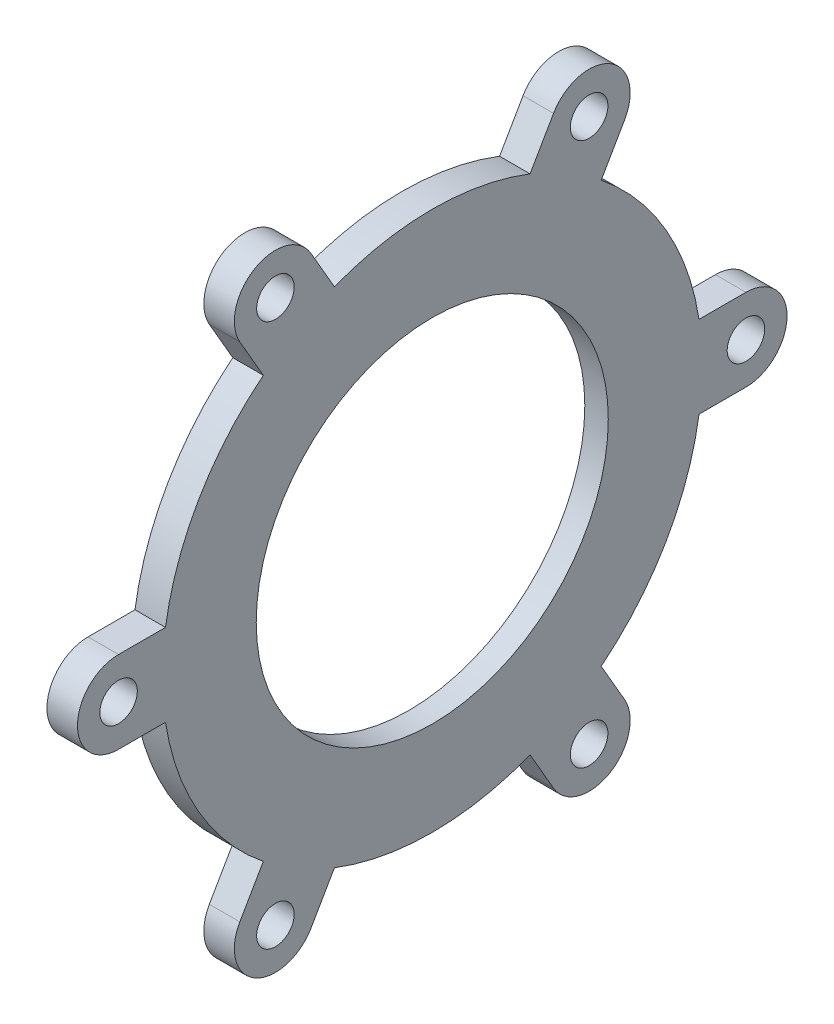
ISO-10303-21;
HEADER;
FILE_DESCRIPTION(('STEP AP214'),'2;1');
FILE_NAME('part.step','',(''),(''),'','','');
FILE_SCHEMA(('AUTOMOTIVE_DESIGN { 1 0 10303 214 1 1 1 1 }'));
ENDSEC;
DATA;
#1=APPLICATION_CONTEXT('core data for automotive mechanical design processes');
#2=APPLICATION_PROTOCOL_DEFINITION('international standard','automotive_design',2000,#1);
#3=PRODUCT_CONTEXT('',#1,'mechanical');
#4=PRODUCT('Part','Part','',(#3));
#5=PRODUCT_RELATED_PRODUCT_CATEGORY('part','',(#4));
#6=PRODUCT_DEFINITION_FORMATION('','',#4);
#7=PRODUCT_DEFINITION_CONTEXT('part definition',#1,'design');
#8=PRODUCT_DEFINITION('design','',#6,#7);
#9=PRODUCT_DEFINITION_SHAPE('','',#8);
#10=(LENGTH_UNIT() NAMED_UNIT(*) SI_UNIT(.MILLI.,.METRE.));
#11=(NAMED_UNIT(*) PLANE_ANGLE_UNIT() SI_UNIT($,.RADIAN.));
#12=(NAMED_UNIT(*) SI_UNIT($,.STERADIAN.) SOLID_ANGLE_UNIT());
#13=UNCERTAINTY_MEASURE_WITH_UNIT(LENGTH_MEASURE(1.E-05),#10,'distance_accuracy_value','');
#14=(GEOMETRIC_REPRESENTATION_CONTEXT(3) GLOBAL_UNCERTAINTY_ASSIGNED_CONTEXT((#13)) GLOBAL_UNIT_ASSIGNED_CONTEXT((#10,
#11,#12)) REPRESENTATION_CONTEXT('',''));
#15=CARTESIAN_POINT('',(0.,0.,0.));
#16=DIRECTION('',(0.,0.,1.));
#17=DIRECTION('',(1.,0.,0.));
#18=AXIS2_PLACEMENT_3D('',#15,#16,#17);
#19=CARTESIAN_POINT('',(0.,0.,0.));
#20=DIRECTION('',(1.,0.,0.));
#21=DIRECTION('',(0.,0.,-1.));
#22=AXIS2_PLACEMENT_3D('',#19,#20,#21);
#23=PLANE('',#22);
#24=CARTESIAN_POINT('',(0.,0.,0.));
#25=DIRECTION('',(1.,0.,0.));
#26=DIRECTION('',(0.,0.,-1.));
#27=AXIS2_PLACEMENT_3D('',#24,#25,#26);
#28=CIRCLE('',#27,92.5);
#29=CARTESIAN_POINT('',(0.,0.,-92.5));
#30=VERTEX_POINT('',#29);
#31=EDGE_CURVE('E11',#30,#30,#28,.F.);
#32=ORIENTED_EDGE('',*,*,#31,.T.);
#33=EDGE_LOOP('',(#32));
#34=FACE_BOUND('',#33,.T.);
#35=CARTESIAN_POINT('',(0.,0.,0.));
#36=DIRECTION('',(1.,0.,0.));
#37=DIRECTION('',(0.,0.,-1.));
#38=AXIS2_PLACEMENT_3D('',#35,#36,#37);
#39=CIRCLE('',#38,75.);
#40=CARTESIAN_POINT('',(0.,0.,-75.));
#41=VERTEX_POINT('',#40);
#42=EDGE_CURVE('E309',#41,#41,#39,.T.);
#43=ORIENTED_EDGE('',*,*,#42,.T.);
#44=EDGE_LOOP('',(#43));
#45=FACE_BOUND('',#44,.T.);
#46=ADVANCED_FACE('F35',(#34,#45),#23,.F.);
#47=CARTESIAN_POINT('',(10.,0.,0.));
#48=DIRECTION('',(-1.,0.,0.));
#49=DIRECTION('',(0.,0.,1.));
#50=AXIS2_PLACEMENT_3D('',#47,#48,#49);
#51=CYLINDRICAL_SURFACE('',#50,115.);
#52=DIRECTION('',(-1.,0.,0.));
#53=VECTOR('',#52,1.);
#54=CARTESIAN_POINT('',(10.,17.5,-113.660679216693));
#55=LINE('',#54,#53);
#56=CARTESIAN_POINT('',(10.,17.5,-113.660679216693));
#57=VERTEX_POINT('',#56);
#58=CARTESIAN_POINT('',(-3.,17.5,-113.660679216693));
#59=VERTEX_POINT('',#58);
#60=EDGE_CURVE('E50',#57,#59,#55,.T.);
#61=ORIENTED_EDGE('',*,*,#60,.T.);
#62=CARTESIAN_POINT('',(-3.,0.,0.));
#63=DIRECTION('',(1.,0.,0.));
#64=DIRECTION('',(0.,0.,-1.));
#65=AXIS2_PLACEMENT_3D('',#62,#63,#64);
#66=CIRCLE('',#65,115.);
#67=CARTESIAN_POINT('',(-3.,89.6830356130487,-71.985784174571));
#68=VERTEX_POINT('',#67);
#69=EDGE_CURVE('E215',#59,#68,#66,.T.);
#70=ORIENTED_EDGE('',*,*,#69,.T.);
#71=DIRECTION('',(-1.,0.,0.));
#72=VECTOR('',#71,1.);
#73=CARTESIAN_POINT('',(10.,89.6830356130487,-71.985784174571));
#74=LINE('',#73,#72);
#75=CARTESIAN_POINT('',(10.,89.6830356130487,-71.985784174571));
#76=VERTEX_POINT('',#75);
#77=EDGE_CURVE('E198',#76,#68,#74,.T.);
#78=ORIENTED_EDGE('',*,*,#77,.F.);
#79=CARTESIAN_POINT('',(10.,0.,0.));
#80=DIRECTION('',(1.,0.,0.));
#81=DIRECTION('',(0.,0.,-1.));
#82=AXIS2_PLACEMENT_3D('',#79,#80,#81);
#83=CIRCLE('',#82,115.);
#84=EDGE_CURVE('E313',#57,#76,#83,.T.);
#85=ORIENTED_EDGE('',*,*,#84,.F.);
#86=EDGE_LOOP('',(#61,#70,#78,#85));
#87=FACE_BOUND('',#86,.T.);
#88=ADVANCED_FACE('F220',(#87),#51,.T.);
#89=CARTESIAN_POINT('',(10.,-8.74999999999879,-15.1554445662256));
#90=DIRECTION('',(0.,0.499999999999999,0.866025403784439));
#91=DIRECTION('',(0.,-0.866025403784439,0.499999999999999));
#92=AXIS2_PLACEMENT_3D('',#89,#90,#91);
#93=PLANE('',#92);
#94=ORIENTED_EDGE('',*,*,#77,.T.);
#95=DIRECTION('',(0.,0.866025403784439,-0.499999999999999));
#96=VECTOR('',#95,1.);
#97=CARTESIAN_POINT('',(-3.,-8.74999999999879,-15.1554445662256));
#98=LINE('',#97,#96);
#99=CARTESIAN_POINT('',(-3.,107.003543688735,-81.985784174569));
#100=VERTEX_POINT('',#99);
#101=EDGE_CURVE('E202',#68,#100,#98,.T.);
#102=ORIENTED_EDGE('',*,*,#101,.T.);
#103=DIRECTION('',(-1.,0.,0.));
#104=VECTOR('',#103,1.);
#105=CARTESIAN_POINT('',(10.,107.003543688735,-81.985784174569));
#106=LINE('',#105,#104);
#107=CARTESIAN_POINT('',(10.,107.003543688735,-81.985784174569));
#108=VERTEX_POINT('',#107);
#109=EDGE_CURVE('E207',#108,#100,#106,.T.);
#110=ORIENTED_EDGE('',*,*,#109,.F.);
#111=DIRECTION('',(0.,0.866025403784439,-0.499999999999999));
#112=VECTOR('',#111,1.);
#113=CARTESIAN_POINT('',(10.,-8.74999999999879,-15.1554445662256));
#114=LINE('',#113,#112);
#115=EDGE_CURVE('E203',#76,#108,#114,.T.);
#116=ORIENTED_EDGE('',*,*,#115,.F.);
#117=EDGE_LOOP('',(#94,#102,#110,#116));
#118=FACE_BOUND('',#117,.T.);
#119=ADVANCED_FACE('F200',(#118),#93,.F.);
#120=CARTESIAN_POINT('',(10.,115.753543688735,-66.8303396083414));
#121=DIRECTION('',(-1.,0.,0.));
#122=DIRECTION('',(0.,0.,1.));
#123=AXIS2_PLACEMENT_3D('',#120,#121,#122);
#124=CYLINDRICAL_SURFACE('',#123,17.5);
#125=ORIENTED_EDGE('',*,*,#109,.T.);
#126=CARTESIAN_POINT('',(-3.,115.753543688735,-66.8303396083414));
#127=DIRECTION('',(1.,0.,0.));
#128=DIRECTION('',(0.,0.,-1.));
#129=AXIS2_PLACEMENT_3D('',#126,#127,#128);
#130=CIRCLE('',#129,17.5);
#131=CARTESIAN_POINT('',(-3.,124.503543688735,-51.6748950421137));
#132=VERTEX_POINT('',#131);
#133=EDGE_CURVE('E218',#132,#100,#130,.F.);
#134=ORIENTED_EDGE('',*,*,#133,.F.);
#135=DIRECTION('',(-1.,0.,0.));
#136=VECTOR('',#135,1.);
#137=CARTESIAN_POINT('',(10.,124.503543688735,-51.6748950421137));
#138=LINE('',#137,#136);
#139=CARTESIAN_POINT('',(10.,124.503543688735,-51.6748950421137));
#140=VERTEX_POINT('',#139);
#141=EDGE_CURVE('E425',#140,#132,#138,.T.);
#142=ORIENTED_EDGE('',*,*,#141,.F.);
#143=CARTESIAN_POINT('',(10.,115.753543688735,-66.8303396083414));
#144=DIRECTION('',(1.,0.,0.));
#145=DIRECTION('',(0.,0.,-1.));
#146=AXIS2_PLACEMENT_3D('',#143,#144,#145);
#147=CIRCLE('',#146,17.5);
#148=EDGE_CURVE('E318',#140,#108,#147,.F.);
#149=ORIENTED_EDGE('',*,*,#148,.T.);
#150=EDGE_LOOP('',(#125,#134,#142,#149));
#151=FACE_BOUND('',#150,.T.);
#152=ADVANCED_FACE('F546',(#151),#124,.T.);
#153=CARTESIAN_POINT('',(10.,8.75000000000122,15.1554445662298));
#154=DIRECTION('',(0.,0.5,0.866025403784439));
#155=DIRECTION('',(0.,-0.866025403784439,0.5));
#156=AXIS2_PLACEMENT_3D('',#153,#154,#155);
#157=PLANE('',#156);
#158=ORIENTED_EDGE('',*,*,#141,.T.);
#159=DIRECTION('',(0.,0.866025403784439,-0.5));
#160=VECTOR('',#159,1.);
#161=CARTESIAN_POINT('',(-3.,8.75000000000122,15.1554445662298));
#162=LINE('',#161,#160);
#163=CARTESIAN_POINT('',(-3.,107.183035613049,-41.6748950421147));
#164=VERTEX_POINT('',#163);
#165=EDGE_CURVE('E233',#164,#132,#162,.T.);
#166=ORIENTED_EDGE('',*,*,#165,.F.);
#167=DIRECTION('',(-1.,0.,0.));
#168=VECTOR('',#167,1.);
#169=CARTESIAN_POINT('',(10.,107.183035613049,-41.6748950421147));
#170=LINE('',#169,#168);
#171=CARTESIAN_POINT('',(10.,107.183035613049,-41.6748950421147));
#172=VERTEX_POINT('',#171);
#173=EDGE_CURVE('E423',#172,#164,#170,.T.);
#174=ORIENTED_EDGE('',*,*,#173,.F.);
#175=DIRECTION('',(0.,0.866025403784439,-0.5));
#176=VECTOR('',#175,1.);
#177=CARTESIAN_POINT('',(10.,8.75000000000122,15.1554445662298));
#178=LINE('',#177,#176);
#179=EDGE_CURVE('E321',#172,#140,#178,.T.);
#180=ORIENTED_EDGE('',*,*,#179,.T.);
#181=EDGE_LOOP('',(#158,#166,#174,#180));
#182=FACE_BOUND('',#181,.T.);
#183=ADVANCED_FACE('F543',(#182),#157,.T.);
#184=ORIENTED_EDGE('',*,*,#173,.T.);
#185=CARTESIAN_POINT('',(-3.,107.183035613044,41.6748950421246));
#186=VERTEX_POINT('',#185);
#187=EDGE_CURVE('E224',#164,#186,#66,.T.);
#188=ORIENTED_EDGE('',*,*,#187,.T.);
#189=DIRECTION('',(-1.,0.,0.));
#190=VECTOR('',#189,1.);
#191=CARTESIAN_POINT('',(10.,107.183035613044,41.6748950421246));
#192=LINE('',#191,#190);
#193=CARTESIAN_POINT('',(10.,107.183035613044,41.6748950421246));
#194=VERTEX_POINT('',#193);
#195=EDGE_CURVE('E421',#194,#186,#192,.T.);
#196=ORIENTED_EDGE('',*,*,#195,.F.);
#197=EDGE_CURVE('E316',#172,#194,#83,.T.);
#198=ORIENTED_EDGE('',*,*,#197,.F.);
#199=EDGE_LOOP('',(#184,#188,#196,#198));
#200=FACE_BOUND('',#199,.T.);
#201=ADVANCED_FACE('F448',(#200),#51,.T.);
#202=CARTESIAN_POINT('',(10.,8.74999999999557,-15.15544456622));
#203=DIRECTION('',(0.,-0.5,0.866025403784438));
#204=DIRECTION('',(0.,-0.866025403784438,-0.5));
#205=AXIS2_PLACEMENT_3D('',#202,#203,#204);
#206=PLANE('',#205);
#207=ORIENTED_EDGE('',*,*,#195,.T.);
#208=DIRECTION('',(0.,0.866025403784438,0.5));
#209=VECTOR('',#208,1.);
#210=CARTESIAN_POINT('',(-3.,8.74999999999557,-15.15544456622));
#211=LINE('',#210,#209);
#212=CARTESIAN_POINT('',(-3.,124.503543688728,51.6748950421231));
#213=VERTEX_POINT('',#212);
#214=EDGE_CURVE('E232',#186,#213,#211,.T.);
#215=ORIENTED_EDGE('',*,*,#214,.T.);
#216=DIRECTION('',(-1.,0.,0.));
#217=VECTOR('',#216,1.);
#218=CARTESIAN_POINT('',(10.,124.503543688728,51.6748950421231));
#219=LINE('',#218,#217);
#220=CARTESIAN_POINT('',(10.,124.503543688728,51.6748950421231));
#221=VERTEX_POINT('',#220);
#222=EDGE_CURVE('E419',#221,#213,#219,.T.);
#223=ORIENTED_EDGE('',*,*,#222,.F.);
#224=DIRECTION('',(0.,0.866025403784438,0.5));
#225=VECTOR('',#224,1.);
#226=CARTESIAN_POINT('',(10.,8.74999999999557,-15.15544456622));
#227=LINE('',#226,#225);
#228=EDGE_CURVE('E324',#194,#221,#227,.T.);
#229=ORIENTED_EDGE('',*,*,#228,.F.);
#230=EDGE_LOOP('',(#207,#215,#223,#229));
#231=FACE_BOUND('',#230,.T.);
#232=ADVANCED_FACE('F538',(#231),#206,.F.);
#233=CARTESIAN_POINT('',(10.,115.753543688728,66.8303396083507));
#234=DIRECTION('',(-1.,0.,0.));
#235=DIRECTION('',(0.,0.,1.));
#236=AXIS2_PLACEMENT_3D('',#233,#234,#235);
#237=CYLINDRICAL_SURFACE('',#236,17.5);
#238=ORIENTED_EDGE('',*,*,#222,.T.);
#239=CARTESIAN_POINT('',(-3.,115.753543688728,66.8303396083507));
#240=DIRECTION('',(1.,0.,0.));
#241=DIRECTION('',(0.,0.,-1.));
#242=AXIS2_PLACEMENT_3D('',#239,#240,#241);
#243=CIRCLE('',#242,17.5);
#244=CARTESIAN_POINT('',(-3.,107.003543688728,81.9857841745784));
#245=VERTEX_POINT('',#244);
#246=EDGE_CURVE('E239',#245,#213,#243,.F.);
#247=ORIENTED_EDGE('',*,*,#246,.F.);
#248=DIRECTION('',(-1.,0.,0.));
#249=VECTOR('',#248,1.);
#250=CARTESIAN_POINT('',(10.,107.003543688728,81.9857841745784));
#251=LINE('',#250,#249);
#252=CARTESIAN_POINT('',(10.,107.003543688728,81.9857841745784));
#253=VERTEX_POINT('',#252);
#254=EDGE_CURVE('E417',#253,#245,#251,.T.);
#255=ORIENTED_EDGE('',*,*,#254,.F.);
#256=CARTESIAN_POINT('',(10.,115.753543688728,66.8303396083507));
#257=DIRECTION('',(1.,0.,0.));
#258=DIRECTION('',(0.,0.,-1.));
#259=AXIS2_PLACEMENT_3D('',#256,#257,#258);
#260=CIRCLE('',#259,17.5);
#261=EDGE_CURVE('E326',#253,#221,#260,.F.);
#262=ORIENTED_EDGE('',*,*,#261,.T.);
#263=EDGE_LOOP('',(#238,#247,#255,#262));
#264=FACE_BOUND('',#263,.T.);
#265=ADVANCED_FACE('F534',(#264),#237,.T.);
#266=CARTESIAN_POINT('',(10.,-8.75000000000442,15.1554445662353));
#267=DIRECTION('',(0.,-0.500000000000001,0.866025403784438));
#268=DIRECTION('',(0.,-0.866025403784438,-0.500000000000001));
#269=AXIS2_PLACEMENT_3D('',#266,#267,#268);
#270=PLANE('',#269);
#271=ORIENTED_EDGE('',*,*,#254,.T.);
#272=DIRECTION('',(0.,0.866025403784438,0.500000000000001));
#273=VECTOR('',#272,1.);
#274=CARTESIAN_POINT('',(-3.,-8.75000000000442,15.1554445662353));
#275=LINE('',#274,#273);
#276=CARTESIAN_POINT('',(-3.,89.6830356130418,71.9857841745801));
#277=VERTEX_POINT('',#276);
#278=EDGE_CURVE('E244',#277,#245,#275,.T.);
#279=ORIENTED_EDGE('',*,*,#278,.F.);
#280=DIRECTION('',(-1.,0.,0.));
#281=VECTOR('',#280,1.);
#282=CARTESIAN_POINT('',(10.,89.6830356130418,71.9857841745801));
#283=LINE('',#282,#281);
#284=CARTESIAN_POINT('',(10.,89.6830356130418,71.9857841745801));
#285=VERTEX_POINT('',#284);
#286=EDGE_CURVE('E415',#285,#277,#283,.T.);
#287=ORIENTED_EDGE('',*,*,#286,.F.);
#288=DIRECTION('',(0.,0.866025403784438,0.500000000000001));
#289=VECTOR('',#288,1.);
#290=CARTESIAN_POINT('',(10.,-8.75000000000442,15.1554445662353));
#291=LINE('',#290,#289);
#292=EDGE_CURVE('E329',#285,#253,#291,.T.);
#293=ORIENTED_EDGE('',*,*,#292,.T.);
#294=EDGE_LOOP('',(#271,#279,#287,#293));
#295=FACE_BOUND('',#294,.T.);
#296=ADVANCED_FACE('F531',(#295),#270,.T.);
#297=ORIENTED_EDGE('',*,*,#286,.T.);
#298=CARTESIAN_POINT('',(-3.,17.4999999999874,113.660679216693));
#299=VERTEX_POINT('',#298);
#300=EDGE_CURVE('E234',#277,#299,#66,.T.);
#301=ORIENTED_EDGE('',*,*,#300,.T.);
#302=DIRECTION('',(-1.,0.,0.));
#303=VECTOR('',#302,1.);
#304=CARTESIAN_POINT('',(10.,17.4999999999874,113.660679216693));
#305=LINE('',#304,#303);
#306=CARTESIAN_POINT('',(10.,17.4999999999874,113.660679216693));
#307=VERTEX_POINT('',#306);
#308=EDGE_CURVE('E413',#307,#299,#305,.T.);
#309=ORIENTED_EDGE('',*,*,#308,.F.);
#310=EDGE_CURVE('E332',#285,#307,#83,.T.);
#311=ORIENTED_EDGE('',*,*,#310,.F.);
#312=EDGE_LOOP('',(#297,#301,#309,#311));
#313=FACE_BOUND('',#312,.T.);
#314=ADVANCED_FACE('F529',(#313),#51,.T.);
#315=CARTESIAN_POINT('',(10.,17.4999999999871,0.));
#316=DIRECTION('',(0.,-1.,0.));
#317=DIRECTION('',(0.,0.,-1.));
#318=AXIS2_PLACEMENT_3D('',#315,#316,#317);
#319=PLANE('',#318);
#320=ORIENTED_EDGE('',*,*,#308,.T.);
#321=DIRECTION('',(0.,0.,1.));
#322=VECTOR('',#321,1.);
#323=CARTESIAN_POINT('',(-3.,17.4999999999871,0.));
#324=LINE('',#323,#322);
#325=CARTESIAN_POINT('',(-3.,17.4999999999871,133.660679216691));
#326=VERTEX_POINT('',#325);
#327=EDGE_CURVE('E243',#299,#326,#324,.T.);
#328=ORIENTED_EDGE('',*,*,#327,.T.);
#329=DIRECTION('',(-1.,0.,0.));
#330=VECTOR('',#329,1.);
#331=CARTESIAN_POINT('',(10.,17.4999999999871,133.660679216691));
#332=LINE('',#331,#330);
#333=CARTESIAN_POINT('',(10.,17.4999999999871,133.660679216691));
#334=VERTEX_POINT('',#333);
#335=EDGE_CURVE('E411',#334,#326,#332,.T.);
#336=ORIENTED_EDGE('',*,*,#335,.F.);
#337=DIRECTION('',(0.,0.,1.));
#338=VECTOR('',#337,1.);
#339=CARTESIAN_POINT('',(10.,17.4999999999871,0.));
#340=LINE('',#339,#338);
#341=EDGE_CURVE('E333',#307,#334,#340,.T.);
#342=ORIENTED_EDGE('',*,*,#341,.F.);
#343=EDGE_LOOP('',(#320,#328,#336,#342));
#344=FACE_BOUND('',#343,.T.);
#345=ADVANCED_FACE('F525',(#344),#319,.F.);
#346=CARTESIAN_POINT('',(10.,-1.29088335857571E-11,133.660679216691));
#347=DIRECTION('',(-1.,0.,0.));
#348=DIRECTION('',(0.,0.,1.));
#349=AXIS2_PLACEMENT_3D('',#346,#347,#348);
#350=CYLINDRICAL_SURFACE('',#349,17.5);
#351=ORIENTED_EDGE('',*,*,#335,.T.);
#352=CARTESIAN_POINT('',(-3.,-1.29088335857571E-11,133.660679216691));
#353=DIRECTION('',(1.,0.,0.));
#354=DIRECTION('',(0.,0.,-1.));
#355=AXIS2_PLACEMENT_3D('',#352,#353,#354);
#356=CIRCLE('',#355,17.5);
#357=CARTESIAN_POINT('',(-3.,-17.5000000000129,133.660679216691));
#358=VERTEX_POINT('',#357);
#359=EDGE_CURVE('E250',#358,#326,#356,.F.);
#360=ORIENTED_EDGE('',*,*,#359,.F.);
#361=DIRECTION('',(-1.,0.,0.));
#362=VECTOR('',#361,1.);
#363=CARTESIAN_POINT('',(10.,-17.5000000000129,133.660679216691));
#364=LINE('',#363,#362);
#365=CARTESIAN_POINT('',(10.,-17.5000000000129,133.660679216691));
#366=VERTEX_POINT('',#365);
#367=EDGE_CURVE('E409',#366,#358,#364,.T.);
#368=ORIENTED_EDGE('',*,*,#367,.F.);
#369=CARTESIAN_POINT('',(10.,-1.29088335857571E-11,133.660679216691));
#370=DIRECTION('',(1.,0.,0.));
#371=DIRECTION('',(0.,0.,-1.));
#372=AXIS2_PLACEMENT_3D('',#369,#370,#371);
#373=CIRCLE('',#372,17.5);
#374=EDGE_CURVE('E335',#366,#334,#373,.F.);
#375=ORIENTED_EDGE('',*,*,#374,.T.);
#376=EDGE_LOOP('',(#351,#360,#368,#375));
#377=FACE_BOUND('',#376,.T.);
#378=ADVANCED_FACE('F521',(#377),#350,.T.);
#379=CARTESIAN_POINT('',(10.,-17.5000000000129,0.));
#380=DIRECTION('',(0.,-1.,0.));
#381=DIRECTION('',(0.,0.,-1.));
#382=AXIS2_PLACEMENT_3D('',#379,#380,#381);
#383=PLANE('',#382);
#384=ORIENTED_EDGE('',*,*,#367,.T.);
#385=DIRECTION('',(0.,0.,1.));
#386=VECTOR('',#385,1.);
#387=CARTESIAN_POINT('',(-3.,-17.5000000000129,0.));
#388=LINE('',#387,#386);
#389=CARTESIAN_POINT('',(-3.,-17.5000000000129,113.660679216691));
#390=VERTEX_POINT('',#389);
#391=EDGE_CURVE('E256',#390,#358,#388,.T.);
#392=ORIENTED_EDGE('',*,*,#391,.F.);
#393=DIRECTION('',(-1.,0.,0.));
#394=VECTOR('',#393,1.);
#395=CARTESIAN_POINT('',(10.,-17.5000000000129,113.660679216691));
#396=LINE('',#395,#394);
#397=CARTESIAN_POINT('',(10.,-17.5000000000129,113.660679216691));
#398=VERTEX_POINT('',#397);
#399=EDGE_CURVE('E407',#398,#390,#396,.T.);
#400=ORIENTED_EDGE('',*,*,#399,.F.);
#401=DIRECTION('',(0.,0.,1.));
#402=VECTOR('',#401,1.);
#403=CARTESIAN_POINT('',(10.,-17.5000000000129,0.));
#404=LINE('',#403,#402);
#405=EDGE_CURVE('E338',#398,#366,#404,.T.);
#406=ORIENTED_EDGE('',*,*,#405,.T.);
#407=EDGE_LOOP('',(#384,#392,#400,#406));
#408=FACE_BOUND('',#407,.T.);
#409=ADVANCED_FACE('F518',(#408),#383,.T.);
#410=ORIENTED_EDGE('',*,*,#399,.T.);
#411=CARTESIAN_POINT('',(-3.,-89.683035613058,71.9857841745664));
#412=VERTEX_POINT('',#411);
#413=EDGE_CURVE('E245',#390,#412,#66,.T.);
#414=ORIENTED_EDGE('',*,*,#413,.T.);
#415=DIRECTION('',(-1.,0.,0.));
#416=VECTOR('',#415,1.);
#417=CARTESIAN_POINT('',(10.,-89.683035613058,71.9857841745664));
#418=LINE('',#417,#416);
#419=CARTESIAN_POINT('',(10.,-89.683035613058,71.9857841745664));
#420=VERTEX_POINT('',#419);
#421=EDGE_CURVE('E405',#420,#412,#418,.T.);
#422=ORIENTED_EDGE('',*,*,#421,.F.);
#423=EDGE_CURVE('E341',#398,#420,#83,.T.);
#424=ORIENTED_EDGE('',*,*,#423,.F.);
#425=EDGE_LOOP('',(#410,#414,#422,#424));
#426=FACE_BOUND('',#425,.T.);
#427=ADVANCED_FACE('F516',(#426),#51,.T.);
#428=CARTESIAN_POINT('',(10.,8.74999999999478,15.1554445662187));
#429=DIRECTION('',(0.,-0.499999999999999,-0.866025403784439));
#430=DIRECTION('',(0.,0.866025403784439,-0.499999999999999));
#431=AXIS2_PLACEMENT_3D('',#428,#429,#430);
#432=PLANE('',#431);
#433=ORIENTED_EDGE('',*,*,#421,.T.);
#434=DIRECTION('',(0.,-0.866025403784439,0.499999999999999));
#435=VECTOR('',#434,1.);
#436=CARTESIAN_POINT('',(-3.,8.74999999999478,15.1554445662187));
#437=LINE('',#436,#435);
#438=CARTESIAN_POINT('',(-3.,-107.003543688748,81.9857841745672));
#439=VERTEX_POINT('',#438);
#440=EDGE_CURVE('E255',#412,#439,#437,.T.);
#441=ORIENTED_EDGE('',*,*,#440,.T.);
#442=DIRECTION('',(-1.,0.,0.));
#443=VECTOR('',#442,1.);
#444=CARTESIAN_POINT('',(10.,-107.003543688748,81.9857841745672));
#445=LINE('',#444,#443);
#446=CARTESIAN_POINT('',(10.,-107.003543688748,81.9857841745672));
#447=VERTEX_POINT('',#446);
#448=EDGE_CURVE('E403',#447,#439,#445,.T.);
#449=ORIENTED_EDGE('',*,*,#448,.F.);
#450=DIRECTION('',(0.,-0.866025403784439,0.499999999999999));
#451=VECTOR('',#450,1.);
#452=CARTESIAN_POINT('',(10.,8.74999999999478,15.1554445662187));
#453=LINE('',#452,#451);
#454=EDGE_CURVE('E342',#420,#447,#453,.T.);
#455=ORIENTED_EDGE('',*,*,#454,.F.);
#456=EDGE_LOOP('',(#433,#441,#449,#455));
#457=FACE_BOUND('',#456,.T.);
#458=ADVANCED_FACE('F512',(#457),#432,.F.);
#459=CARTESIAN_POINT('',(10.,-115.753543688748,66.8303396083395));
#460=DIRECTION('',(-1.,0.,0.));
#461=DIRECTION('',(0.,0.,1.));
#462=AXIS2_PLACEMENT_3D('',#459,#460,#461);
#463=CYLINDRICAL_SURFACE('',#462,17.5);
#464=ORIENTED_EDGE('',*,*,#448,.T.);
#465=CARTESIAN_POINT('',(-3.,-115.753543688748,66.8303396083395));
#466=DIRECTION('',(1.,0.,0.));
#467=DIRECTION('',(0.,0.,-1.));
#468=AXIS2_PLACEMENT_3D('',#465,#466,#467);
#469=CIRCLE('',#468,17.5);
#470=CARTESIAN_POINT('',(-3.,-124.503543688748,51.6748950421118));
#471=VERTEX_POINT('',#470);
#472=EDGE_CURVE('E261',#471,#439,#469,.F.);
#473=ORIENTED_EDGE('',*,*,#472,.F.);
#474=DIRECTION('',(-1.,0.,0.));
#475=VECTOR('',#474,1.);
#476=CARTESIAN_POINT('',(10.,-124.503543688748,51.6748950421118));
#477=LINE('',#476,#475);
#478=CARTESIAN_POINT('',(10.,-124.503543688748,51.6748950421118));
#479=VERTEX_POINT('',#478);
#480=EDGE_CURVE('E401',#479,#471,#477,.T.);
#481=ORIENTED_EDGE('',*,*,#480,.F.);
#482=CARTESIAN_POINT('',(10.,-115.753543688748,66.8303396083395));
#483=DIRECTION('',(1.,0.,0.));
#484=DIRECTION('',(0.,0.,-1.));
#485=AXIS2_PLACEMENT_3D('',#482,#483,#484);
#486=CIRCLE('',#485,17.5);
#487=EDGE_CURVE('E344',#479,#447,#486,.F.);
#488=ORIENTED_EDGE('',*,*,#487,.T.);
#489=EDGE_LOOP('',(#464,#473,#481,#488));
#490=FACE_BOUND('',#489,.T.);
#491=ADVANCED_FACE('F508',(#490),#463,.T.);
#492=CARTESIAN_POINT('',(10.,-8.75000000000522,-15.1554445662367));
#493=DIRECTION('',(0.,-0.5,-0.866025403784439));
#494=DIRECTION('',(0.,0.866025403784439,-0.5));
#495=AXIS2_PLACEMENT_3D('',#492,#493,#494);
#496=PLANE('',#495);
#497=ORIENTED_EDGE('',*,*,#480,.T.);
#498=DIRECTION('',(0.,-0.866025403784439,0.5));
#499=VECTOR('',#498,1.);
#500=CARTESIAN_POINT('',(-3.,-8.75000000000522,-15.1554445662367));
#501=LINE('',#500,#499);
#502=CARTESIAN_POINT('',(-3.,-107.183035613056,41.6748950421108));
#503=VERTEX_POINT('',#502);
#504=EDGE_CURVE('E267',#503,#471,#501,.T.);
#505=ORIENTED_EDGE('',*,*,#504,.F.);
#506=DIRECTION('',(-1.,0.,0.));
#507=VECTOR('',#506,1.);
#508=CARTESIAN_POINT('',(10.,-107.183035613056,41.6748950421108));
#509=LINE('',#508,#507);
#510=CARTESIAN_POINT('',(10.,-107.183035613056,41.6748950421108));
#511=VERTEX_POINT('',#510);
#512=EDGE_CURVE('E399',#511,#503,#509,.T.);
#513=ORIENTED_EDGE('',*,*,#512,.F.);
#514=DIRECTION('',(0.,-0.866025403784439,0.5));
#515=VECTOR('',#514,1.);
#516=CARTESIAN_POINT('',(10.,-8.75000000000522,-15.1554445662367));
#517=LINE('',#516,#515);
#518=EDGE_CURVE('E347',#511,#479,#517,.T.);
#519=ORIENTED_EDGE('',*,*,#518,.T.);
#520=EDGE_LOOP('',(#497,#505,#513,#519));
#521=FACE_BOUND('',#520,.T.);
#522=ADVANCED_FACE('F505',(#521),#496,.T.);
#523=ORIENTED_EDGE('',*,*,#512,.T.);
#524=CARTESIAN_POINT('',(-3.,-107.18303561305,-41.6748950421241));
#525=VERTEX_POINT('',#524);
#526=EDGE_CURVE('E230',#503,#525,#66,.T.);
#527=ORIENTED_EDGE('',*,*,#526,.T.);
#528=DIRECTION('',(-1.,0.,0.));
#529=VECTOR('',#528,1.);
#530=CARTESIAN_POINT('',(10.,-107.18303561305,-41.6748950421241));
#531=LINE('',#530,#529);
#532=CARTESIAN_POINT('',(10.,-107.18303561305,-41.6748950421241));
#533=VERTEX_POINT('',#532);
#534=EDGE_CURVE('E397',#533,#525,#531,.T.);
#535=ORIENTED_EDGE('',*,*,#534,.F.);
#536=EDGE_CURVE('E350',#511,#533,#83,.T.);
#537=ORIENTED_EDGE('',*,*,#536,.F.);
#538=EDGE_LOOP('',(#523,#527,#535,#537));
#539=FACE_BOUND('',#538,.T.);
#540=ADVANCED_FACE('F493',(#539),#51,.T.);
#541=CARTESIAN_POINT('',(10.,-8.74999999999795,15.1554445662241));
#542=DIRECTION('',(0.,0.5,-0.866025403784439));
#543=DIRECTION('',(0.,0.866025403784439,0.5));
#544=AXIS2_PLACEMENT_3D('',#541,#542,#543);
#545=PLANE('',#544);
#546=ORIENTED_EDGE('',*,*,#534,.T.);
#547=DIRECTION('',(0.,-0.866025403784439,-0.5));
#548=VECTOR('',#547,1.);
#549=CARTESIAN_POINT('',(-3.,-8.74999999999795,15.1554445662241));
#550=LINE('',#549,#548);
#551=CARTESIAN_POINT('',(-3.,-124.503543688741,-51.6748950421249));
#552=VERTEX_POINT('',#551);
#553=EDGE_CURVE('E266',#525,#552,#550,.T.);
#554=ORIENTED_EDGE('',*,*,#553,.T.);
#555=DIRECTION('',(-1.,0.,0.));
#556=VECTOR('',#555,1.);
#557=CARTESIAN_POINT('',(10.,-124.503543688741,-51.6748950421249));
#558=LINE('',#557,#556);
#559=CARTESIAN_POINT('',(10.,-124.503543688741,-51.6748950421249));
#560=VERTEX_POINT('',#559);
#561=EDGE_CURVE('E395',#560,#552,#558,.T.);
#562=ORIENTED_EDGE('',*,*,#561,.F.);
#563=DIRECTION('',(0.,-0.866025403784439,-0.5));
#564=VECTOR('',#563,1.);
#565=CARTESIAN_POINT('',(10.,-8.74999999999795,15.1554445662241));
#566=LINE('',#565,#564);
#567=EDGE_CURVE('E351',#533,#560,#566,.T.);
#568=ORIENTED_EDGE('',*,*,#567,.F.);
#569=EDGE_LOOP('',(#546,#554,#562,#568));
#570=FACE_BOUND('',#569,.T.);
#571=ADVANCED_FACE('F500',(#570),#545,.F.);
#572=CARTESIAN_POINT('',(10.,-115.753543688741,-66.8303396083526));
#573=DIRECTION('',(-1.,0.,0.));
#574=DIRECTION('',(0.,0.,1.));
#575=AXIS2_PLACEMENT_3D('',#572,#573,#574);
#576=CYLINDRICAL_SURFACE('',#575,17.5);
#577=ORIENTED_EDGE('',*,*,#561,.T.);
#578=CARTESIAN_POINT('',(-3.,-115.753543688741,-66.8303396083526));
#579=DIRECTION('',(1.,0.,0.));
#580=DIRECTION('',(0.,0.,-1.));
#581=AXIS2_PLACEMENT_3D('',#578,#579,#580);
#582=CIRCLE('',#581,17.5);
#583=CARTESIAN_POINT('',(-3.,-107.003543688741,-81.9857841745803));
#584=VERTEX_POINT('',#583);
#585=EDGE_CURVE('E272',#584,#552,#582,.F.);
#586=ORIENTED_EDGE('',*,*,#585,.F.);
#587=DIRECTION('',(-1.,0.,0.));
#588=VECTOR('',#587,1.);
#589=CARTESIAN_POINT('',(10.,-107.003543688741,-81.9857841745803));
#590=LINE('',#589,#588);
#591=CARTESIAN_POINT('',(10.,-107.003543688741,-81.9857841745803));
#592=VERTEX_POINT('',#591);
#593=EDGE_CURVE('E393',#592,#584,#590,.T.);
#594=ORIENTED_EDGE('',*,*,#593,.F.);
#595=CARTESIAN_POINT('',(10.,-115.753543688741,-66.8303396083526));
#596=DIRECTION('',(1.,0.,0.));
#597=DIRECTION('',(0.,0.,-1.));
#598=AXIS2_PLACEMENT_3D('',#595,#596,#597);
#599=CIRCLE('',#598,17.5);
#600=EDGE_CURVE('E353',#592,#560,#599,.F.);
#601=ORIENTED_EDGE('',*,*,#600,.T.);
#602=EDGE_LOOP('',(#577,#586,#594,#601));
#603=FACE_BOUND('',#602,.T.);
#604=ADVANCED_FACE('F496',(#603),#576,.T.);
#605=CARTESIAN_POINT('',(10.,8.75000000000204,-15.1554445662312));
#606=DIRECTION('',(0.,0.5,-0.866025403784439));
#607=DIRECTION('',(0.,0.866025403784439,0.5));
#608=AXIS2_PLACEMENT_3D('',#605,#606,#607);
#609=PLANE('',#608);
#610=ORIENTED_EDGE('',*,*,#593,.T.);
#611=DIRECTION('',(0.,-0.866025403784439,-0.5));
#612=VECTOR('',#611,1.);
#613=CARTESIAN_POINT('',(-3.,8.75000000000204,-15.1554445662312));
#614=LINE('',#613,#612);
#615=CARTESIAN_POINT('',(-3.,-89.6830356130503,-71.9857841745785));
#616=VERTEX_POINT('',#615);
#617=EDGE_CURVE('E229',#616,#584,#614,.T.);
#618=ORIENTED_EDGE('',*,*,#617,.F.);
#619=DIRECTION('',(-1.,0.,0.));
#620=VECTOR('',#619,1.);
#621=CARTESIAN_POINT('',(10.,-89.6830356130503,-71.9857841745785));
#622=LINE('',#621,#620);
#623=CARTESIAN_POINT('',(10.,-89.6830356130503,-71.9857841745785));
#624=VERTEX_POINT('',#623);
#625=EDGE_CURVE('E391',#624,#616,#622,.T.);
#626=ORIENTED_EDGE('',*,*,#625,.F.);
#627=DIRECTION('',(0.,-0.866025403784439,-0.5));
#628=VECTOR('',#627,1.);
#629=CARTESIAN_POINT('',(10.,8.75000000000204,-15.1554445662312));
#630=LINE('',#629,#628);
#631=EDGE_CURVE('E356',#624,#592,#630,.T.);
#632=ORIENTED_EDGE('',*,*,#631,.T.);
#633=EDGE_LOOP('',(#610,#618,#626,#632));
#634=FACE_BOUND('',#633,.T.);
#635=ADVANCED_FACE('F491',(#634),#609,.T.);
#636=ORIENTED_EDGE('',*,*,#625,.T.);
#637=CARTESIAN_POINT('',(-3.,-17.5,-113.660679216693));
#638=VERTEX_POINT('',#637);
#639=EDGE_CURVE('E223',#616,#638,#66,.T.);
#640=ORIENTED_EDGE('',*,*,#639,.T.);
#641=DIRECTION('',(-1.,0.,0.));
#642=VECTOR('',#641,1.);
#643=CARTESIAN_POINT('',(10.,-17.5,-113.660679216693));
#644=LINE('',#643,#642);
#645=CARTESIAN_POINT('',(10.,-17.5,-113.660679216693));
#646=VERTEX_POINT('',#645);
#647=EDGE_CURVE('E389',#646,#638,#644,.T.);
#648=ORIENTED_EDGE('',*,*,#647,.F.);
#649=EDGE_CURVE('E315',#624,#646,#83,.T.);
#650=ORIENTED_EDGE('',*,*,#649,.F.);
#651=EDGE_LOOP('',(#636,#640,#648,#650));
#652=FACE_BOUND('',#651,.T.);
#653=ADVANCED_FACE('F449',(#652),#51,.T.);
#654=CARTESIAN_POINT('',(10.,-17.5,0.));
#655=DIRECTION('',(0.,1.,0.));
#656=DIRECTION('',(0.,0.,1.));
#657=AXIS2_PLACEMENT_3D('',#654,#655,#656);
#658=PLANE('',#657);
#659=ORIENTED_EDGE('',*,*,#647,.T.);
#660=DIRECTION('',(0.,0.,-1.));
#661=VECTOR('',#660,1.);
#662=CARTESIAN_POINT('',(-3.,-17.5,0.));
#663=LINE('',#662,#661);
#664=CARTESIAN_POINT('',(-3.,-17.5,-133.660679216693));
#665=VERTEX_POINT('',#664);
#666=EDGE_CURVE('E228',#638,#665,#663,.T.);
#667=ORIENTED_EDGE('',*,*,#666,.T.);
#668=DIRECTION('',(-1.,0.,0.));
#669=VECTOR('',#668,1.);
#670=CARTESIAN_POINT('',(10.,-17.5,-133.660679216693));
#671=LINE('',#670,#669);
#672=CARTESIAN_POINT('',(10.,-17.5,-133.660679216693));
#673=VERTEX_POINT('',#672);
#674=EDGE_CURVE('E387',#673,#665,#671,.T.);
#675=ORIENTED_EDGE('',*,*,#674,.F.);
#676=DIRECTION('',(0.,0.,-1.));
#677=VECTOR('',#676,1.);
#678=CARTESIAN_POINT('',(10.,-17.5,0.));
#679=LINE('',#678,#677);
#680=EDGE_CURVE('E359',#646,#673,#679,.T.);
#681=ORIENTED_EDGE('',*,*,#680,.F.);
#682=EDGE_LOOP('',(#659,#667,#675,#681));
#683=FACE_BOUND('',#682,.T.);
#684=ADVANCED_FACE('F486',(#683),#658,.F.);
#685=CARTESIAN_POINT('',(10.,0.,-133.660679216693));
#686=DIRECTION('',(-1.,0.,0.));
#687=DIRECTION('',(0.,0.,1.));
#688=AXIS2_PLACEMENT_3D('',#685,#686,#687);
#689=CYLINDRICAL_SURFACE('',#688,17.5);
#690=ORIENTED_EDGE('',*,*,#674,.T.);
#691=CARTESIAN_POINT('',(-3.,0.,-133.660679216693));
#692=DIRECTION('',(1.,0.,0.));
#693=DIRECTION('',(0.,0.,-1.));
#694=AXIS2_PLACEMENT_3D('',#691,#692,#693);
#695=CIRCLE('',#694,17.5);
#696=CARTESIAN_POINT('',(-3.,17.5,-133.660679216693));
#697=VERTEX_POINT('',#696);
#698=EDGE_CURVE('E286',#697,#665,#695,.F.);
#699=ORIENTED_EDGE('',*,*,#698,.F.);
#700=DIRECTION('',(-1.,0.,0.));
#701=VECTOR('',#700,1.);
#702=CARTESIAN_POINT('',(10.,17.5,-133.660679216693));
#703=LINE('',#702,#701);
#704=CARTESIAN_POINT('',(10.,17.5,-133.660679216693));
#705=VERTEX_POINT('',#704);
#706=EDGE_CURVE('E58',#705,#697,#703,.T.);
#707=ORIENTED_EDGE('',*,*,#706,.F.);
#708=CARTESIAN_POINT('',(10.,0.,-133.660679216693));
#709=DIRECTION('',(1.,0.,0.));
#710=DIRECTION('',(0.,0.,-1.));
#711=AXIS2_PLACEMENT_3D('',#708,#709,#710);
#712=CIRCLE('',#711,17.5);
#713=EDGE_CURVE('E361',#705,#673,#712,.F.);
#714=ORIENTED_EDGE('',*,*,#713,.T.);
#715=EDGE_LOOP('',(#690,#699,#707,#714));
#716=FACE_BOUND('',#715,.T.);
#717=ADVANCED_FACE('F464',(#716),#689,.T.);
#718=CARTESIAN_POINT('',(10.,115.753543688735,-66.8303396083414));
#719=DIRECTION('',(-1.,0.,0.));
#720=DIRECTION('',(0.,0.,1.));
#721=AXIS2_PLACEMENT_3D('',#718,#719,#720);
#722=CYLINDRICAL_SURFACE('',#721,8.00000000000462);
#723=CARTESIAN_POINT('',(10.,115.753543688735,-66.8303396083414));
#724=DIRECTION('',(1.,0.,0.));
#725=DIRECTION('',(0.,0.,-1.));
#726=AXIS2_PLACEMENT_3D('',#723,#724,#725);
#727=CIRCLE('',#726,8.00000000000462);
#728=CARTESIAN_POINT('',(10.,115.753543688735,-74.830339608346));
#729=VERTEX_POINT('',#728);
#730=EDGE_CURVE('E377',#729,#729,#727,.T.);
#731=ORIENTED_EDGE('',*,*,#730,.T.);
#732=EDGE_LOOP('',(#731));
#733=FACE_BOUND('',#732,.T.);
#734=CARTESIAN_POINT('',(-3.,115.753543688735,-66.8303396083414));
#735=DIRECTION('',(1.,0.,0.));
#736=DIRECTION('',(0.,0.,-1.));
#737=AXIS2_PLACEMENT_3D('',#734,#735,#736);
#738=CIRCLE('',#737,8.00000000000462);
#739=CARTESIAN_POINT('',(-3.,115.753543688735,-74.830339608346));
#740=VERTEX_POINT('',#739);
#741=EDGE_CURVE('E303',#740,#740,#738,.T.);
#742=ORIENTED_EDGE('',*,*,#741,.F.);
#743=EDGE_LOOP('',(#742));
#744=FACE_BOUND('',#743,.T.);
#745=ADVANCED_FACE('F460',(#733,#744),#722,.F.);
#746=CARTESIAN_POINT('',(10.,115.753543688728,66.8303396083507));
#747=DIRECTION('',(-1.,0.,0.));
#748=DIRECTION('',(0.,0.,1.));
#749=AXIS2_PLACEMENT_3D('',#746,#747,#748);
#750=CYLINDRICAL_SURFACE('',#749,8.00000000000373);
#751=CARTESIAN_POINT('',(10.,115.753543688728,66.8303396083507));
#752=DIRECTION('',(1.,0.,0.));
#753=DIRECTION('',(0.,0.,-1.));
#754=AXIS2_PLACEMENT_3D('',#751,#752,#753);
#755=CIRCLE('',#754,8.00000000000373);
#756=CARTESIAN_POINT('',(10.,115.753543688728,58.830339608347));
#757=VERTEX_POINT('',#756);
#758=EDGE_CURVE('E374',#757,#757,#755,.T.);
#759=ORIENTED_EDGE('',*,*,#758,.T.);
#760=EDGE_LOOP('',(#759));
#761=FACE_BOUND('',#760,.T.);
#762=CARTESIAN_POINT('',(-3.,115.753543688728,66.8303396083507));
#763=DIRECTION('',(1.,0.,0.));
#764=DIRECTION('',(0.,0.,-1.));
#765=AXIS2_PLACEMENT_3D('',#762,#763,#764);
#766=CIRCLE('',#765,8.00000000000373);
#767=CARTESIAN_POINT('',(-3.,115.753543688728,58.830339608347));
#768=VERTEX_POINT('',#767);
#769=EDGE_CURVE('E300',#768,#768,#766,.T.);
#770=ORIENTED_EDGE('',*,*,#769,.F.);
#771=EDGE_LOOP('',(#770));
#772=FACE_BOUND('',#771,.T.);
#773=ADVANCED_FACE('F463',(#761,#772),#750,.F.);
#774=CARTESIAN_POINT('',(10.,-1.29088335857571E-11,133.660679216691));
#775=DIRECTION('',(-1.,0.,0.));
#776=DIRECTION('',(0.,0.,1.));
#777=AXIS2_PLACEMENT_3D('',#774,#775,#776);
#778=CYLINDRICAL_SURFACE('',#777,7.99999999999781);
#779=CARTESIAN_POINT('',(10.,-1.29088335857571E-11,133.660679216691));
#780=DIRECTION('',(1.,0.,0.));
#781=DIRECTION('',(0.,0.,-1.));
#782=AXIS2_PLACEMENT_3D('',#779,#780,#781);
#783=CIRCLE('',#782,7.99999999999781);
#784=CARTESIAN_POINT('',(10.,-1.29088335857571E-11,125.660679216693));
#785=VERTEX_POINT('',#784);
#786=EDGE_CURVE('E371',#785,#785,#783,.T.);
#787=ORIENTED_EDGE('',*,*,#786,.T.);
#788=EDGE_LOOP('',(#787));
#789=FACE_BOUND('',#788,.T.);
#790=CARTESIAN_POINT('',(-3.,-1.29088335857571E-11,133.660679216691));
#791=DIRECTION('',(1.,0.,0.));
#792=DIRECTION('',(0.,0.,-1.));
#793=AXIS2_PLACEMENT_3D('',#790,#791,#792);
#794=CIRCLE('',#793,7.99999999999781);
#795=CARTESIAN_POINT('',(-3.,-1.29088335857571E-11,125.660679216693));
#796=VERTEX_POINT('',#795);
#797=EDGE_CURVE('E297',#796,#796,#794,.T.);
#798=ORIENTED_EDGE('',*,*,#797,.F.);
#799=EDGE_LOOP('',(#798));
#800=FACE_BOUND('',#799,.T.);
#801=ADVANCED_FACE('F468',(#789,#800),#778,.F.);
#802=CARTESIAN_POINT('',(10.,-115.753543688748,66.8303396083395));
#803=DIRECTION('',(-1.,0.,0.));
#804=DIRECTION('',(0.,0.,1.));
#805=AXIS2_PLACEMENT_3D('',#802,#803,#804);
#806=CYLINDRICAL_SURFACE('',#805,7.9999999999928);
#807=CARTESIAN_POINT('',(10.,-115.753543688748,66.8303396083395));
#808=DIRECTION('',(1.,0.,0.));
#809=DIRECTION('',(0.,0.,-1.));
#810=AXIS2_PLACEMENT_3D('',#807,#808,#809);
#811=CIRCLE('',#810,7.9999999999928);
#812=CARTESIAN_POINT('',(10.,-115.753543688748,58.8303396083467));
#813=VERTEX_POINT('',#812);
#814=EDGE_CURVE('E368',#813,#813,#811,.T.);
#815=ORIENTED_EDGE('',*,*,#814,.T.);
#816=EDGE_LOOP('',(#815));
#817=FACE_BOUND('',#816,.T.);
#818=CARTESIAN_POINT('',(-3.,-115.753543688748,66.8303396083395));
#819=DIRECTION('',(1.,0.,0.));
#820=DIRECTION('',(0.,0.,-1.));
#821=AXIS2_PLACEMENT_3D('',#818,#819,#820);
#822=CIRCLE('',#821,7.9999999999928);
#823=CARTESIAN_POINT('',(-3.,-115.753543688748,58.8303396083467));
#824=VERTEX_POINT('',#823);
#825=EDGE_CURVE('E294',#824,#824,#822,.T.);
#826=ORIENTED_EDGE('',*,*,#825,.F.);
#827=EDGE_LOOP('',(#826));
#828=FACE_BOUND('',#827,.T.);
#829=ADVANCED_FACE('F472',(#817,#828),#806,.F.);
#830=CARTESIAN_POINT('',(10.,-115.753543688741,-66.8303396083526));
#831=DIRECTION('',(-1.,0.,0.));
#832=DIRECTION('',(0.,0.,1.));
#833=AXIS2_PLACEMENT_3D('',#830,#831,#832);
#834=CYLINDRICAL_SURFACE('',#833,7.99999999999385);
#835=CARTESIAN_POINT('',(10.,-115.753543688741,-66.8303396083526));
#836=DIRECTION('',(1.,0.,0.));
#837=DIRECTION('',(0.,0.,-1.));
#838=AXIS2_PLACEMENT_3D('',#835,#836,#837);
#839=CIRCLE('',#838,7.99999999999385);
#840=CARTESIAN_POINT('',(10.,-115.753543688741,-74.8303396083464));
#841=VERTEX_POINT('',#840);
#842=EDGE_CURVE('E365',#841,#841,#839,.T.);
#843=ORIENTED_EDGE('',*,*,#842,.T.);
#844=EDGE_LOOP('',(#843));
#845=FACE_BOUND('',#844,.T.);
#846=CARTESIAN_POINT('',(-3.,-115.753543688741,-66.8303396083526));
#847=DIRECTION('',(1.,0.,0.));
#848=DIRECTION('',(0.,0.,-1.));
#849=AXIS2_PLACEMENT_3D('',#846,#847,#848);
#850=CIRCLE('',#849,7.99999999999385);
#851=CARTESIAN_POINT('',(-3.,-115.753543688741,-74.8303396083464));
#852=VERTEX_POINT('',#851);
#853=EDGE_CURVE('E291',#852,#852,#850,.T.);
#854=ORIENTED_EDGE('',*,*,#853,.F.);
#855=EDGE_LOOP('',(#854));
#856=FACE_BOUND('',#855,.T.);
#857=ADVANCED_FACE('F476',(#845,#856),#834,.F.);
#858=CARTESIAN_POINT('',(10.,17.5,0.));
#859=DIRECTION('',(0.,1.,0.));
#860=DIRECTION('',(0.,0.,1.));
#861=AXIS2_PLACEMENT_3D('',#858,#859,#860);
#862=PLANE('',#861);
#863=ORIENTED_EDGE('',*,*,#706,.T.);
#864=DIRECTION('',(0.,0.,-1.));
#865=VECTOR('',#864,1.);
#866=CARTESIAN_POINT('',(-3.,17.5,0.));
#867=LINE('',#866,#865);
#868=EDGE_CURVE('E289',#59,#697,#867,.T.);
#869=ORIENTED_EDGE('',*,*,#868,.F.);
#870=ORIENTED_EDGE('',*,*,#60,.F.);
#871=DIRECTION('',(0.,0.,-1.));
#872=VECTOR('',#871,1.);
#873=CARTESIAN_POINT('',(10.,17.5,0.));
#874=LINE('',#873,#872);
#875=EDGE_CURVE('E363',#57,#705,#874,.T.);
#876=ORIENTED_EDGE('',*,*,#875,.T.);
#877=EDGE_LOOP('',(#863,#869,#870,#876));
#878=FACE_BOUND('',#877,.T.);
#879=ADVANCED_FACE('F480',(#878),#862,.T.);
#880=CARTESIAN_POINT('',(10.,0.,0.));
#881=DIRECTION('',(-1.,0.,0.));
#882=DIRECTION('',(0.,0.,1.));
#883=AXIS2_PLACEMENT_3D('',#880,#881,#882);
#884=CYLINDRICAL_SURFACE('',#883,75.);
#885=CARTESIAN_POINT('',(10.,0.,0.));
#886=DIRECTION('',(1.,0.,0.));
#887=DIRECTION('',(0.,0.,-1.));
#888=AXIS2_PLACEMENT_3D('',#885,#886,#887);
#889=CIRCLE('',#888,75.);
#890=CARTESIAN_POINT('',(10.,0.,-75.));
#891=VERTEX_POINT('',#890);
#892=EDGE_CURVE('E310',#891,#891,#889,.T.);
#893=ORIENTED_EDGE('',*,*,#892,.T.);
#894=EDGE_LOOP('',(#893));
#895=FACE_BOUND('',#894,.T.);
#896=ORIENTED_EDGE('',*,*,#42,.F.);
#897=EDGE_LOOP('',(#896));
#898=FACE_BOUND('',#897,.T.);
#899=ADVANCED_FACE('F458',(#895,#898),#884,.F.);
#900=CARTESIAN_POINT('',(10.,0.,-133.660679216693));
#901=DIRECTION('',(-1.,0.,0.));
#902=DIRECTION('',(0.,0.,1.));
#903=AXIS2_PLACEMENT_3D('',#900,#901,#902);
#904=CYLINDRICAL_SURFACE('',#903,8.00000000000001);
#905=CARTESIAN_POINT('',(10.,0.,-133.660679216693));
#906=DIRECTION('',(1.,0.,0.));
#907=DIRECTION('',(0.,0.,-1.));
#908=AXIS2_PLACEMENT_3D('',#905,#906,#907);
#909=CIRCLE('',#908,8.00000000000001);
#910=CARTESIAN_POINT('',(10.,0.,-141.660679216693));
#911=VERTEX_POINT('',#910);
#912=EDGE_CURVE('E380',#911,#911,#909,.T.);
#913=ORIENTED_EDGE('',*,*,#912,.T.);
#914=EDGE_LOOP('',(#913));
#915=FACE_BOUND('',#914,.T.);
#916=CARTESIAN_POINT('',(-3.,0.,-133.660679216693));
#917=DIRECTION('',(1.,0.,0.));
#918=DIRECTION('',(0.,0.,-1.));
#919=AXIS2_PLACEMENT_3D('',#916,#917,#918);
#920=CIRCLE('',#919,8.00000000000001);
#921=CARTESIAN_POINT('',(-3.,0.,-141.660679216693));
#922=VERTEX_POINT('',#921);
#923=EDGE_CURVE('E306',#922,#922,#920,.T.);
#924=ORIENTED_EDGE('',*,*,#923,.F.);
#925=EDGE_LOOP('',(#924));
#926=FACE_BOUND('',#925,.T.);
#927=ADVANCED_FACE('F455',(#915,#926),#904,.F.);
#928=CARTESIAN_POINT('',(10.,0.,0.));
#929=DIRECTION('',(1.,0.,0.));
#930=DIRECTION('',(0.,0.,-1.));
#931=AXIS2_PLACEMENT_3D('',#928,#929,#930);
#932=PLANE('',#931);
#933=ORIENTED_EDGE('',*,*,#892,.F.);
#934=EDGE_LOOP('',(#933));
#935=FACE_BOUND('',#934,.T.);
#936=ORIENTED_EDGE('',*,*,#84,.T.);
#937=ORIENTED_EDGE('',*,*,#115,.T.);
#938=ORIENTED_EDGE('',*,*,#148,.F.);
#939=ORIENTED_EDGE('',*,*,#179,.F.);
#940=ORIENTED_EDGE('',*,*,#197,.T.);
#941=ORIENTED_EDGE('',*,*,#228,.T.);
#942=ORIENTED_EDGE('',*,*,#261,.F.);
#943=ORIENTED_EDGE('',*,*,#292,.F.);
#944=ORIENTED_EDGE('',*,*,#310,.T.);
#945=ORIENTED_EDGE('',*,*,#341,.T.);
#946=ORIENTED_EDGE('',*,*,#374,.F.);
#947=ORIENTED_EDGE('',*,*,#405,.F.);
#948=ORIENTED_EDGE('',*,*,#423,.T.);
#949=ORIENTED_EDGE('',*,*,#454,.T.);
#950=ORIENTED_EDGE('',*,*,#487,.F.);
#951=ORIENTED_EDGE('',*,*,#518,.F.);
#952=ORIENTED_EDGE('',*,*,#536,.T.);
#953=ORIENTED_EDGE('',*,*,#567,.T.);
#954=ORIENTED_EDGE('',*,*,#600,.F.);
#955=ORIENTED_EDGE('',*,*,#631,.F.);
#956=ORIENTED_EDGE('',*,*,#649,.T.);
#957=ORIENTED_EDGE('',*,*,#680,.T.);
#958=ORIENTED_EDGE('',*,*,#713,.F.);
#959=ORIENTED_EDGE('',*,*,#875,.F.);
#960=EDGE_LOOP('',(#936,#937,#938,#939,#940,#941,#942,#943,#944,#945,#946,#947,#948,#949,#950,
#951,#952,#953,#954,#955,#956,#957,#958,#959));
#961=FACE_BOUND('',#960,.T.);
#962=ORIENTED_EDGE('',*,*,#842,.F.);
#963=EDGE_LOOP('',(#962));
#964=FACE_BOUND('',#963,.T.);
#965=ORIENTED_EDGE('',*,*,#814,.F.);
#966=EDGE_LOOP('',(#965));
#967=FACE_BOUND('',#966,.T.);
#968=ORIENTED_EDGE('',*,*,#786,.F.);
#969=EDGE_LOOP('',(#968));
#970=FACE_BOUND('',#969,.T.);
#971=ORIENTED_EDGE('',*,*,#758,.F.);
#972=EDGE_LOOP('',(#971));
#973=FACE_BOUND('',#972,.T.);
#974=ORIENTED_EDGE('',*,*,#730,.F.);
#975=EDGE_LOOP('',(#974));
#976=FACE_BOUND('',#975,.T.);
#977=ORIENTED_EDGE('',*,*,#912,.F.);
#978=EDGE_LOOP('',(#977));
#979=FACE_BOUND('',#978,.T.);
#980=ADVANCED_FACE('F453',(#935,#961,#964,#967,#970,#973,#976,#979),#932,.T.);
#981=CARTESIAN_POINT('',(-3.,0.,0.));
#982=DIRECTION('',(1.,0.,0.));
#983=DIRECTION('',(0.,0.,-1.));
#984=AXIS2_PLACEMENT_3D('',#981,#982,#983);
#985=CYLINDRICAL_SURFACE('',#984,95.);
#986=CARTESIAN_POINT('',(-2.5,0.,0.));
#987=DIRECTION('',(1.,0.,0.));
#988=DIRECTION('',(0.,0.,-1.));
#989=AXIS2_PLACEMENT_3D('',#986,#987,#988);
#990=CIRCLE('',#989,95.);
#991=CARTESIAN_POINT('',(-2.5,0.,-95.));
#992=VERTEX_POINT('',#991);
#993=EDGE_CURVE('E43',#992,#992,#990,.T.);
#994=ORIENTED_EDGE('',*,*,#993,.T.);
#995=EDGE_LOOP('',(#994));
#996=FACE_BOUND('',#995,.T.);
#997=CARTESIAN_POINT('',(-3.,0.,0.));
#998=DIRECTION('',(1.,0.,0.));
#999=DIRECTION('',(0.,0.,-1.));
#1000=AXIS2_PLACEMENT_3D('',#997,#998,#999);
#1001=CIRCLE('',#1000,95.);
#1002=CARTESIAN_POINT('',(-3.,0.,-95.));
#1003=VERTEX_POINT('',#1002);
#1004=EDGE_CURVE('E221',#1003,#1003,#1001,.T.);
#1005=ORIENTED_EDGE('',*,*,#1004,.F.);
#1006=EDGE_LOOP('',(#1005));
#1007=FACE_BOUND('',#1006,.T.);
#1008=ADVANCED_FACE('F430',(#996,#1007),#985,.F.);
#1009=CARTESIAN_POINT('',(-3.,0.,0.));
#1010=DIRECTION('',(1.,0.,0.));
#1011=DIRECTION('',(0.,0.,-1.));
#1012=AXIS2_PLACEMENT_3D('',#1009,#1010,#1011);
#1013=PLANE('',#1012);
#1014=ORIENTED_EDGE('',*,*,#1004,.T.);
#1015=EDGE_LOOP('',(#1014));
#1016=FACE_BOUND('',#1015,.T.);
#1017=ORIENTED_EDGE('',*,*,#69,.F.);
#1018=ORIENTED_EDGE('',*,*,#868,.T.);
#1019=ORIENTED_EDGE('',*,*,#698,.T.);
#1020=ORIENTED_EDGE('',*,*,#666,.F.);
#1021=ORIENTED_EDGE('',*,*,#639,.F.);
#1022=ORIENTED_EDGE('',*,*,#617,.T.);
#1023=ORIENTED_EDGE('',*,*,#585,.T.);
#1024=ORIENTED_EDGE('',*,*,#553,.F.);
#1025=ORIENTED_EDGE('',*,*,#526,.F.);
#1026=ORIENTED_EDGE('',*,*,#504,.T.);
#1027=ORIENTED_EDGE('',*,*,#472,.T.);
#1028=ORIENTED_EDGE('',*,*,#440,.F.);
#1029=ORIENTED_EDGE('',*,*,#413,.F.);
#1030=ORIENTED_EDGE('',*,*,#391,.T.);
#1031=ORIENTED_EDGE('',*,*,#359,.T.);
#1032=ORIENTED_EDGE('',*,*,#327,.F.);
#1033=ORIENTED_EDGE('',*,*,#300,.F.);
#1034=ORIENTED_EDGE('',*,*,#278,.T.);
#1035=ORIENTED_EDGE('',*,*,#246,.T.);
#1036=ORIENTED_EDGE('',*,*,#214,.F.);
#1037=ORIENTED_EDGE('',*,*,#187,.F.);
#1038=ORIENTED_EDGE('',*,*,#165,.T.);
#1039=ORIENTED_EDGE('',*,*,#133,.T.);
#1040=ORIENTED_EDGE('',*,*,#101,.F.);
#1041=EDGE_LOOP('',(#1017,#1018,#1019,#1020,#1021,#1022,#1023,#1024,#1025,#1026,#1027,#1028,
#1029,#1030,#1031,#1032,#1033,#1034,#1035,#1036,#1037,#1038,#1039,#1040));
#1042=FACE_BOUND('',#1041,.T.);
#1043=ORIENTED_EDGE('',*,*,#853,.T.);
#1044=EDGE_LOOP('',(#1043));
#1045=FACE_BOUND('',#1044,.T.);
#1046=ORIENTED_EDGE('',*,*,#825,.T.);
#1047=EDGE_LOOP('',(#1046));
#1048=FACE_BOUND('',#1047,.T.);
#1049=ORIENTED_EDGE('',*,*,#797,.T.);
#1050=EDGE_LOOP('',(#1049));
#1051=FACE_BOUND('',#1050,.T.);
#1052=ORIENTED_EDGE('',*,*,#769,.T.);
#1053=EDGE_LOOP('',(#1052));
#1054=FACE_BOUND('',#1053,.T.);
#1055=ORIENTED_EDGE('',*,*,#741,.T.);
#1056=EDGE_LOOP('',(#1055));
#1057=FACE_BOUND('',#1056,.T.);
#1058=ORIENTED_EDGE('',*,*,#923,.T.);
#1059=EDGE_LOOP('',(#1058));
#1060=FACE_BOUND('',#1059,.T.);
#1061=ADVANCED_FACE('F212',(#1016,#1042,#1045,#1048,#1051,#1054,#1057,#1060),#1013,.F.);
#1062=CARTESIAN_POINT('',(-2.5,0.,0.));
#1063=DIRECTION('',(1.,0.,0.));
#1064=DIRECTION('',(0.,0.,-1.));
#1065=AXIS2_PLACEMENT_3D('',#1062,#1063,#1064);
#1066=TOROIDAL_SURFACE('',#1065,92.5,2.5);
#1067=ORIENTED_EDGE('',*,*,#31,.F.);
#1068=EDGE_LOOP('',(#1067));
#1069=FACE_BOUND('',#1068,.T.);
#1070=ORIENTED_EDGE('',*,*,#993,.F.);
#1071=EDGE_LOOP('',(#1070));
#1072=FACE_BOUND('',#1071,.T.);
#1073=ADVANCED_FACE('F37',(#1069,#1072),#1066,.F.);
#1074=CLOSED_SHELL('',(#46,#88,#119,#152,#183,#201,#232,#265,#296,#314,#345,#378,#409,#427,#458,
#491,#522,#540,#571,#604,#635,#653,#684,#717,#745,#773,#801,#829,#857,#879,#899,#927,#980,#1008,
#1061,#1073));
#1075=MANIFOLD_SOLID_BREP('B2',#1074);
#1076=ADVANCED_BREP_SHAPE_REPRESENTATION('',(#18,#1075),#14);
#1077=SHAPE_DEFINITION_REPRESENTATION(#9,#1076);
ENDSEC;
END-ISO-10303-21;
